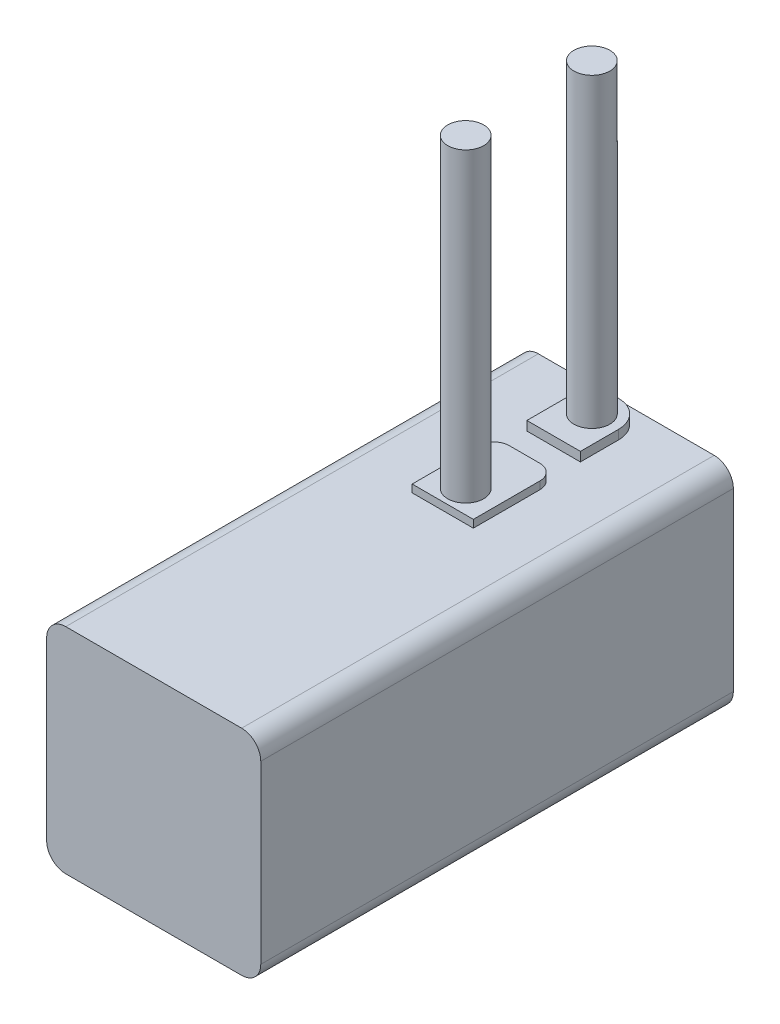
ISO-10303-21;
HEADER;
FILE_DESCRIPTION(('STEP AP214'),'2;1');
FILE_NAME('part.step','',(''),(''),'','','');
FILE_SCHEMA(('AUTOMOTIVE_DESIGN { 1 0 10303 214 1 1 1 1 }'));
ENDSEC;
DATA;
#1=APPLICATION_CONTEXT('core data for automotive mechanical design processes');
#2=APPLICATION_PROTOCOL_DEFINITION('international standard','automotive_design',2000,#1);
#3=PRODUCT_CONTEXT('',#1,'mechanical');
#4=PRODUCT('Part','Part','',(#3));
#5=PRODUCT_RELATED_PRODUCT_CATEGORY('part','',(#4));
#6=PRODUCT_DEFINITION_FORMATION('','',#4);
#7=PRODUCT_DEFINITION_CONTEXT('part definition',#1,'design');
#8=PRODUCT_DEFINITION('design','',#6,#7);
#9=PRODUCT_DEFINITION_SHAPE('','',#8);
#10=(LENGTH_UNIT() NAMED_UNIT(*) SI_UNIT(.MILLI.,.METRE.));
#11=(NAMED_UNIT(*) PLANE_ANGLE_UNIT() SI_UNIT($,.RADIAN.));
#12=(NAMED_UNIT(*) SI_UNIT($,.STERADIAN.) SOLID_ANGLE_UNIT());
#13=UNCERTAINTY_MEASURE_WITH_UNIT(LENGTH_MEASURE(1.E-05),#10,'distance_accuracy_value','');
#14=(GEOMETRIC_REPRESENTATION_CONTEXT(3) GLOBAL_UNCERTAINTY_ASSIGNED_CONTEXT((#13)) GLOBAL_UNIT_ASSIGNED_CONTEXT((#10,
#11,#12)) REPRESENTATION_CONTEXT('',''));
#15=CARTESIAN_POINT('',(0.,0.,0.));
#16=DIRECTION('',(0.,0.,1.));
#17=DIRECTION('',(1.,0.,0.));
#18=AXIS2_PLACEMENT_3D('',#15,#16,#17);
#19=CARTESIAN_POINT('',(-2.42693221990232,-2.5,-61.8));
#20=DIRECTION('',(0.,0.,-1.));
#21=DIRECTION('',(0.,1.,0.));
#22=AXIS2_PLACEMENT_3D('',#19,#20,#21);
#23=PLANE('',#22);
#24=DIRECTION('',(1.,0.,0.));
#25=VECTOR('',#24,1.);
#26=CARTESIAN_POINT('',(-2.42693221990232,-0.599999999999999,-61.8));
#27=LINE('',#26,#25);
#28=CARTESIAN_POINT('',(2.42693221990232,-0.599999999999999,-61.8));
#29=VERTEX_POINT('',#28);
#30=CARTESIAN_POINT('',(-2.42693221990232,-0.599999999999999,-61.8));
#31=VERTEX_POINT('',#30);
#32=EDGE_CURVE('E172',#29,#31,#27,.F.);
#33=ORIENTED_EDGE('',*,*,#32,.F.);
#34=CARTESIAN_POINT('',(0.,0.,-61.8));
#35=DIRECTION('',(0.,0.,-1.));
#36=DIRECTION('',(0.970772887960928,-0.24,0.));
#37=AXIS2_PLACEMENT_3D('',#34,#35,#36);
#38=CIRCLE('',#37,2.5);
#39=EDGE_CURVE('E162',#31,#29,#38,.F.);
#40=ORIENTED_EDGE('',*,*,#39,.F.);
#41=EDGE_LOOP('',(#33,#40));
#42=FACE_BOUND('',#41,.T.);
#43=ADVANCED_FACE('F17',(#42),#23,.T.);
#44=CARTESIAN_POINT('',(-2.42693221990232,0.6,-61.8));
#45=DIRECTION('',(0.,0.,-1.));
#46=DIRECTION('',(0.,1.,0.));
#47=AXIS2_PLACEMENT_3D('',#44,#45,#46);
#48=PLANE('',#47);
#49=DIRECTION('',(-1.,0.,0.));
#50=VECTOR('',#49,1.);
#51=CARTESIAN_POINT('',(2.42693221990232,0.6,-61.8));
#52=LINE('',#51,#50);
#53=CARTESIAN_POINT('',(-2.42693221990232,0.6,-61.8));
#54=VERTEX_POINT('',#53);
#55=CARTESIAN_POINT('',(2.42693221990232,0.6,-61.8));
#56=VERTEX_POINT('',#55);
#57=EDGE_CURVE('E171',#54,#56,#52,.F.);
#58=ORIENTED_EDGE('',*,*,#57,.F.);
#59=CARTESIAN_POINT('',(0.,0.,-61.8));
#60=DIRECTION('',(0.,0.,-1.));
#61=DIRECTION('',(-0.970772887960928,0.24,0.));
#62=AXIS2_PLACEMENT_3D('',#59,#60,#61);
#63=CIRCLE('',#62,2.5);
#64=EDGE_CURVE('E188',#56,#54,#63,.F.);
#65=ORIENTED_EDGE('',*,*,#64,.F.);
#66=EDGE_LOOP('',(#58,#65));
#67=FACE_BOUND('',#66,.T.);
#68=ADVANCED_FACE('F498',(#67),#48,.T.);
#69=CARTESIAN_POINT('',(-11.5,14.,-61.8));
#70=DIRECTION('',(0.,1.,0.));
#71=DIRECTION('',(0.,0.,1.));
#72=AXIS2_PLACEMENT_3D('',#69,#70,#71);
#73=PLANE('',#72);
#74=DIRECTION('',(1.,0.,0.));
#75=VECTOR('',#74,1.);
#76=CARTESIAN_POINT('',(-11.5,14.,0.));
#77=LINE('',#76,#75);
#78=CARTESIAN_POINT('',(11.5,14.,0.));
#79=VERTEX_POINT('',#78);
#80=CARTESIAN_POINT('',(-11.5,14.,0.));
#81=VERTEX_POINT('',#80);
#82=EDGE_CURVE('E192',#79,#81,#77,.F.);
#83=ORIENTED_EDGE('',*,*,#82,.F.);
#84=DIRECTION('',(0.,0.,-1.));
#85=VECTOR('',#84,1.);
#86=CARTESIAN_POINT('',(11.5,14.,0.));
#87=LINE('',#86,#85);
#88=CARTESIAN_POINT('',(11.5,14.,-61.8));
#89=VERTEX_POINT('',#88);
#90=EDGE_CURVE('E196',#89,#79,#87,.F.);
#91=ORIENTED_EDGE('',*,*,#90,.F.);
#92=DIRECTION('',(-1.,0.,0.));
#93=VECTOR('',#92,1.);
#94=CARTESIAN_POINT('',(11.5,14.,-61.8));
#95=LINE('',#94,#93);
#96=CARTESIAN_POINT('',(-11.5,14.,-61.8));
#97=VERTEX_POINT('',#96);
#98=EDGE_CURVE('E201',#89,#97,#95,.T.);
#99=ORIENTED_EDGE('',*,*,#98,.T.);
#100=DIRECTION('',(0.,0.,1.));
#101=VECTOR('',#100,1.);
#102=CARTESIAN_POINT('',(-11.5,14.,-61.8));
#103=LINE('',#102,#101);
#104=EDGE_CURVE('E206',#97,#81,#103,.T.);
#105=ORIENTED_EDGE('',*,*,#104,.T.);
#106=EDGE_LOOP('',(#83,#91,#99,#105));
#107=FACE_BOUND('',#106,.T.);
#108=DIRECTION('',(0.,0.,-1.));
#109=VECTOR('',#108,1.);
#110=CARTESIAN_POINT('',(-4.,14.,-37.8));
#111=LINE('',#110,#109);
#112=CARTESIAN_POINT('',(-4.,14.,-46.5));
#113=VERTEX_POINT('',#112);
#114=CARTESIAN_POINT('',(-4.,14.,-37.8));
#115=VERTEX_POINT('',#114);
#116=EDGE_CURVE('E211',#113,#115,#111,.F.);
#117=ORIENTED_EDGE('',*,*,#116,.F.);
#118=CARTESIAN_POINT('',(-1.99999999999984,14.,-46.5));
#119=DIRECTION('',(0.,-1.,0.));
#120=DIRECTION('',(-1.,0.,0.));
#121=AXIS2_PLACEMENT_3D('',#118,#119,#120);
#122=CIRCLE('',#121,2.00000000000015);
#123=CARTESIAN_POINT('',(-1.99999999999992,14.,-48.5000000000002));
#124=VERTEX_POINT('',#123);
#125=EDGE_CURVE('E216',#124,#113,#122,.F.);
#126=ORIENTED_EDGE('',*,*,#125,.F.);
#127=DIRECTION('',(1.,0.,0.));
#128=VECTOR('',#127,1.);
#129=CARTESIAN_POINT('',(-1.99999999999992,14.,-48.5000000000001));
#130=LINE('',#129,#128);
#131=CARTESIAN_POINT('',(1.99999999999993,14.,-48.5000000000001));
#132=VERTEX_POINT('',#131);
#133=EDGE_CURVE('E221',#132,#124,#130,.F.);
#134=ORIENTED_EDGE('',*,*,#133,.F.);
#135=CARTESIAN_POINT('',(1.99999999999984,14.,-46.5));
#136=DIRECTION('',(0.,-1.,0.));
#137=DIRECTION('',(0.,0.,-1.));
#138=AXIS2_PLACEMENT_3D('',#135,#136,#137);
#139=CIRCLE('',#138,2.00000000000016);
#140=CARTESIAN_POINT('',(4.,14.,-46.5));
#141=VERTEX_POINT('',#140);
#142=EDGE_CURVE('E225',#141,#132,#139,.F.);
#143=ORIENTED_EDGE('',*,*,#142,.F.);
#144=DIRECTION('',(0.,0.,1.));
#145=VECTOR('',#144,1.);
#146=CARTESIAN_POINT('',(4.,14.,-46.5));
#147=LINE('',#146,#145);
#148=CARTESIAN_POINT('',(4.,14.,-37.8));
#149=VERTEX_POINT('',#148);
#150=EDGE_CURVE('E230',#149,#141,#147,.F.);
#151=ORIENTED_EDGE('',*,*,#150,.F.);
#152=DIRECTION('',(-1.,0.,0.));
#153=VECTOR('',#152,1.);
#154=CARTESIAN_POINT('',(4.,14.,-37.8));
#155=LINE('',#154,#153);
#156=EDGE_CURVE('E235',#115,#149,#155,.F.);
#157=ORIENTED_EDGE('',*,*,#156,.F.);
#158=EDGE_LOOP('',(#117,#126,#134,#143,#151,#157));
#159=FACE_BOUND('',#158,.T.);
#160=DIRECTION('',(0.,0.,-1.));
#161=VECTOR('',#160,1.);
#162=CARTESIAN_POINT('',(-3.5,14.,-52.3));
#163=LINE('',#162,#161);
#164=CARTESIAN_POINT('',(-3.5,14.,-57.3));
#165=VERTEX_POINT('',#164);
#166=CARTESIAN_POINT('',(-3.5,14.,-52.3));
#167=VERTEX_POINT('',#166);
#168=EDGE_CURVE('E240',#165,#167,#163,.F.);
#169=ORIENTED_EDGE('',*,*,#168,.F.);
#170=CARTESIAN_POINT('',(0.,14.,-57.3));
#171=DIRECTION('',(0.,-1.,0.));
#172=DIRECTION('',(-1.,0.,0.));
#173=AXIS2_PLACEMENT_3D('',#170,#171,#172);
#174=CIRCLE('',#173,3.5);
#175=CARTESIAN_POINT('',(3.5,14.,-57.3));
#176=VERTEX_POINT('',#175);
#177=EDGE_CURVE('E245',#176,#165,#174,.F.);
#178=ORIENTED_EDGE('',*,*,#177,.F.);
#179=DIRECTION('',(0.,0.,1.));
#180=VECTOR('',#179,1.);
#181=CARTESIAN_POINT('',(3.5,14.,-57.3));
#182=LINE('',#181,#180);
#183=CARTESIAN_POINT('',(3.5,14.,-52.3));
#184=VERTEX_POINT('',#183);
#185=EDGE_CURVE('E250',#184,#176,#182,.F.);
#186=ORIENTED_EDGE('',*,*,#185,.F.);
#187=DIRECTION('',(-1.,0.,0.));
#188=VECTOR('',#187,1.);
#189=CARTESIAN_POINT('',(3.5,14.,-52.3));
#190=LINE('',#189,#188);
#191=EDGE_CURVE('E254',#167,#184,#190,.F.);
#192=ORIENTED_EDGE('',*,*,#191,.F.);
#193=EDGE_LOOP('',(#169,#178,#186,#192));
#194=FACE_BOUND('',#193,.T.);
#195=ADVANCED_FACE('F503',(#107,#159,#194),#73,.T.);
#196=CARTESIAN_POINT('',(-11.4999999999987,11.4999999999987,-61.8));
#197=DIRECTION('',(0.,0.,1.));
#198=DIRECTION('',(-5.03535931630014E-13,1.,0.));
#199=AXIS2_PLACEMENT_3D('',#196,#197,#198);
#200=CYLINDRICAL_SURFACE('',#199,2.50000000000126);
#201=CARTESIAN_POINT('',(-11.4999999999987,11.4999999999987,0.));
#202=DIRECTION('',(0.,0.,-1.));
#203=DIRECTION('',(-1.,5.03774799653657E-13,0.));
#204=AXIS2_PLACEMENT_3D('',#201,#202,#203);
#205=CIRCLE('',#204,2.50000000000126);
#206=CARTESIAN_POINT('',(-14.,11.5,0.));
#207=VERTEX_POINT('',#206);
#208=EDGE_CURVE('E259',#81,#207,#205,.F.);
#209=ORIENTED_EDGE('',*,*,#208,.F.);
#210=ORIENTED_EDGE('',*,*,#104,.F.);
#211=CARTESIAN_POINT('',(-11.4999999999987,11.4999999999987,-61.8));
#212=DIRECTION('',(0.,0.,1.));
#213=DIRECTION('',(-5.03774799653657E-13,1.,0.));
#214=AXIS2_PLACEMENT_3D('',#211,#212,#213);
#215=CIRCLE('',#214,2.50000000000126);
#216=CARTESIAN_POINT('',(-14.,11.5,-61.8));
#217=VERTEX_POINT('',#216);
#218=EDGE_CURVE('E263',#97,#217,#215,.T.);
#219=ORIENTED_EDGE('',*,*,#218,.T.);
#220=DIRECTION('',(0.,0.,1.));
#221=VECTOR('',#220,1.);
#222=CARTESIAN_POINT('',(-14.,11.5,-61.8));
#223=LINE('',#222,#221);
#224=EDGE_CURVE('E268',#217,#207,#223,.T.);
#225=ORIENTED_EDGE('',*,*,#224,.T.);
#226=EDGE_LOOP('',(#209,#210,#219,#225));
#227=FACE_BOUND('',#226,.T.);
#228=ADVANCED_FACE('F509',(#227),#200,.T.);
#229=CARTESIAN_POINT('',(-14.,-11.5,-61.8));
#230=DIRECTION('',(-1.,0.,0.));
#231=DIRECTION('',(0.,0.,1.));
#232=AXIS2_PLACEMENT_3D('',#229,#230,#231);
#233=PLANE('',#232);
#234=DIRECTION('',(0.,1.,0.));
#235=VECTOR('',#234,1.);
#236=CARTESIAN_POINT('',(-14.,-11.5,0.));
#237=LINE('',#236,#235);
#238=CARTESIAN_POINT('',(-14.,-11.5,0.));
#239=VERTEX_POINT('',#238);
#240=EDGE_CURVE('E273',#207,#239,#237,.F.);
#241=ORIENTED_EDGE('',*,*,#240,.F.);
#242=ORIENTED_EDGE('',*,*,#224,.F.);
#243=DIRECTION('',(0.,-1.,0.));
#244=VECTOR('',#243,1.);
#245=CARTESIAN_POINT('',(-14.,11.5,-61.8));
#246=LINE('',#245,#244);
#247=CARTESIAN_POINT('',(-14.,-11.5,-61.8));
#248=VERTEX_POINT('',#247);
#249=EDGE_CURVE('E277',#217,#248,#246,.T.);
#250=ORIENTED_EDGE('',*,*,#249,.T.);
#251=DIRECTION('',(0.,0.,1.));
#252=VECTOR('',#251,1.);
#253=CARTESIAN_POINT('',(-14.,-11.5,-61.8));
#254=LINE('',#253,#252);
#255=EDGE_CURVE('E282',#248,#239,#254,.T.);
#256=ORIENTED_EDGE('',*,*,#255,.T.);
#257=EDGE_LOOP('',(#241,#242,#250,#256));
#258=FACE_BOUND('',#257,.T.);
#259=ADVANCED_FACE('F513',(#258),#233,.T.);
#260=CARTESIAN_POINT('',(-11.4999999999987,-11.4999999999987,-61.8));
#261=DIRECTION('',(0.,0.,1.));
#262=DIRECTION('',(-1.,-5.03474699290056E-13,0.));
#263=AXIS2_PLACEMENT_3D('',#260,#261,#262);
#264=CYLINDRICAL_SURFACE('',#263,2.50000000000126);
#265=CARTESIAN_POINT('',(-11.4999999999987,-11.4999999999987,0.));
#266=DIRECTION('',(0.,0.,-1.));
#267=DIRECTION('',(-5.03774799653657E-13,-1.,0.));
#268=AXIS2_PLACEMENT_3D('',#265,#266,#267);
#269=CIRCLE('',#268,2.50000000000126);
#270=CARTESIAN_POINT('',(-11.5,-14.,0.));
#271=VERTEX_POINT('',#270);
#272=EDGE_CURVE('E287',#239,#271,#269,.F.);
#273=ORIENTED_EDGE('',*,*,#272,.F.);
#274=ORIENTED_EDGE('',*,*,#255,.F.);
#275=CARTESIAN_POINT('',(-11.4999999999987,-11.4999999999987,-61.8));
#276=DIRECTION('',(0.,0.,1.));
#277=DIRECTION('',(-1.,-5.03774799653657E-13,0.));
#278=AXIS2_PLACEMENT_3D('',#275,#276,#277);
#279=CIRCLE('',#278,2.50000000000126);
#280=CARTESIAN_POINT('',(-11.5,-14.,-61.8));
#281=VERTEX_POINT('',#280);
#282=EDGE_CURVE('E291',#248,#281,#279,.T.);
#283=ORIENTED_EDGE('',*,*,#282,.T.);
#284=DIRECTION('',(0.,0.,1.));
#285=VECTOR('',#284,1.);
#286=CARTESIAN_POINT('',(-11.5,-14.,-61.8));
#287=LINE('',#286,#285);
#288=EDGE_CURVE('E296',#281,#271,#287,.T.);
#289=ORIENTED_EDGE('',*,*,#288,.T.);
#290=EDGE_LOOP('',(#273,#274,#283,#289));
#291=FACE_BOUND('',#290,.T.);
#292=ADVANCED_FACE('F517',(#291),#264,.T.);
#293=CARTESIAN_POINT('',(-11.5,-14.,0.));
#294=DIRECTION('',(0.,-1.,0.));
#295=DIRECTION('',(0.,0.,-1.));
#296=AXIS2_PLACEMENT_3D('',#293,#294,#295);
#297=PLANE('',#296);
#298=DIRECTION('',(-1.,0.,0.));
#299=VECTOR('',#298,1.);
#300=CARTESIAN_POINT('',(11.5,-14.,0.));
#301=LINE('',#300,#299);
#302=CARTESIAN_POINT('',(11.5,-14.,0.));
#303=VERTEX_POINT('',#302);
#304=EDGE_CURVE('E301',#271,#303,#301,.F.);
#305=ORIENTED_EDGE('',*,*,#304,.F.);
#306=ORIENTED_EDGE('',*,*,#288,.F.);
#307=DIRECTION('',(1.,0.,0.));
#308=VECTOR('',#307,1.);
#309=CARTESIAN_POINT('',(-11.5,-14.,-61.8));
#310=LINE('',#309,#308);
#311=CARTESIAN_POINT('',(11.5,-14.,-61.8));
#312=VERTEX_POINT('',#311);
#313=EDGE_CURVE('E305',#281,#312,#310,.T.);
#314=ORIENTED_EDGE('',*,*,#313,.T.);
#315=DIRECTION('',(0.,0.,1.));
#316=VECTOR('',#315,1.);
#317=CARTESIAN_POINT('',(11.5,-14.,-61.8));
#318=LINE('',#317,#316);
#319=EDGE_CURVE('E310',#312,#303,#318,.T.);
#320=ORIENTED_EDGE('',*,*,#319,.T.);
#321=EDGE_LOOP('',(#305,#306,#314,#320));
#322=FACE_BOUND('',#321,.T.);
#323=ADVANCED_FACE('F521',(#322),#297,.T.);
#324=CARTESIAN_POINT('',(11.4999999999987,-11.4999999999987,-61.8));
#325=DIRECTION('',(0.,0.,1.));
#326=DIRECTION('',(5.02525288530399E-13,-1.,0.));
#327=AXIS2_PLACEMENT_3D('',#324,#325,#326);
#328=CYLINDRICAL_SURFACE('',#327,2.50000000000126);
#329=CARTESIAN_POINT('',(11.4999999999987,-11.4999999999987,0.));
#330=DIRECTION('',(0.,0.,-1.));
#331=DIRECTION('',(1.,-2.52242671194708E-13,0.));
#332=AXIS2_PLACEMENT_3D('',#329,#330,#331);
#333=CIRCLE('',#332,2.50000000000126);
#334=CARTESIAN_POINT('',(14.,-11.4999999999994,0.));
#335=VERTEX_POINT('',#334);
#336=EDGE_CURVE('E315',#303,#335,#333,.F.);
#337=ORIENTED_EDGE('',*,*,#336,.F.);
#338=ORIENTED_EDGE('',*,*,#319,.F.);
#339=CARTESIAN_POINT('',(11.4999999999987,-11.4999999999987,-61.8));
#340=DIRECTION('',(0.,0.,1.));
#341=DIRECTION('',(5.05195885125177E-13,-1.,0.));
#342=AXIS2_PLACEMENT_3D('',#339,#340,#341);
#343=CIRCLE('',#342,2.50000000000126);
#344=CARTESIAN_POINT('',(14.,-11.4999999999993,-61.8));
#345=VERTEX_POINT('',#344);
#346=EDGE_CURVE('E319',#312,#345,#343,.T.);
#347=ORIENTED_EDGE('',*,*,#346,.T.);
#348=DIRECTION('',(0.,0.,1.));
#349=VECTOR('',#348,1.);
#350=CARTESIAN_POINT('',(14.,-11.4999999999993,-61.8));
#351=LINE('',#350,#349);
#352=EDGE_CURVE('E324',#345,#335,#351,.T.);
#353=ORIENTED_EDGE('',*,*,#352,.T.);
#354=EDGE_LOOP('',(#337,#338,#347,#353));
#355=FACE_BOUND('',#354,.T.);
#356=ADVANCED_FACE('F525',(#355),#328,.T.);
#357=CARTESIAN_POINT('',(14.,-11.4999999999994,0.));
#358=DIRECTION('',(1.,0.,0.));
#359=DIRECTION('',(0.,0.,-1.));
#360=AXIS2_PLACEMENT_3D('',#357,#358,#359);
#361=PLANE('',#360);
#362=DIRECTION('',(0.,-1.,0.));
#363=VECTOR('',#362,1.);
#364=CARTESIAN_POINT('',(14.,11.4999999999999,0.));
#365=LINE('',#364,#363);
#366=CARTESIAN_POINT('',(14.,11.4999999999999,0.));
#367=VERTEX_POINT('',#366);
#368=EDGE_CURVE('E329',#335,#367,#365,.F.);
#369=ORIENTED_EDGE('',*,*,#368,.F.);
#370=ORIENTED_EDGE('',*,*,#352,.F.);
#371=DIRECTION('',(0.,1.,0.));
#372=VECTOR('',#371,1.);
#373=CARTESIAN_POINT('',(14.,-11.4999999999993,-61.8));
#374=LINE('',#373,#372);
#375=CARTESIAN_POINT('',(14.,11.4999999999999,-61.8));
#376=VERTEX_POINT('',#375);
#377=EDGE_CURVE('E333',#345,#376,#374,.T.);
#378=ORIENTED_EDGE('',*,*,#377,.T.);
#379=DIRECTION('',(0.,0.,1.));
#380=VECTOR('',#379,1.);
#381=CARTESIAN_POINT('',(14.,11.4999999999999,-61.8));
#382=LINE('',#381,#380);
#383=EDGE_CURVE('E338',#376,#367,#382,.T.);
#384=ORIENTED_EDGE('',*,*,#383,.T.);
#385=EDGE_LOOP('',(#369,#370,#378,#384));
#386=FACE_BOUND('',#385,.T.);
#387=ADVANCED_FACE('F529',(#386),#361,.T.);
#388=CARTESIAN_POINT('',(11.4999999999987,11.4999999999987,-61.8));
#389=DIRECTION('',(0.,0.,1.));
#390=DIRECTION('',(1.,0.,0.));
#391=AXIS2_PLACEMENT_3D('',#388,#389,#390);
#392=CYLINDRICAL_SURFACE('',#391,2.50000000000126);
#393=CARTESIAN_POINT('',(11.4999999999987,11.4999999999987,0.));
#394=DIRECTION('',(0.,0.,-1.));
#395=DIRECTION('',(5.06616970596696E-13,1.,0.));
#396=AXIS2_PLACEMENT_3D('',#393,#394,#395);
#397=CIRCLE('',#396,2.50000000000126);
#398=EDGE_CURVE('E343',#367,#79,#397,.F.);
#399=ORIENTED_EDGE('',*,*,#398,.F.);
#400=ORIENTED_EDGE('',*,*,#383,.F.);
#401=CARTESIAN_POINT('',(11.4999999999987,11.4999999999987,-61.8));
#402=DIRECTION('',(0.,0.,1.));
#403=DIRECTION('',(1.,4.63984406451112E-13,0.));
#404=AXIS2_PLACEMENT_3D('',#401,#402,#403);
#405=CIRCLE('',#404,2.50000000000126);
#406=EDGE_CURVE('E347',#376,#89,#405,.T.);
#407=ORIENTED_EDGE('',*,*,#406,.T.);
#408=ORIENTED_EDGE('',*,*,#90,.T.);
#409=EDGE_LOOP('',(#399,#400,#407,#408));
#410=FACE_BOUND('',#409,.T.);
#411=ADVANCED_FACE('F533',(#410),#392,.T.);
#412=CARTESIAN_POINT('',(-14.,-14.,-61.8));
#413=DIRECTION('',(0.,0.,-1.));
#414=DIRECTION('',(0.,1.,0.));
#415=AXIS2_PLACEMENT_3D('',#412,#413,#414);
#416=PLANE('',#415);
#417=ORIENTED_EDGE('',*,*,#218,.F.);
#418=ORIENTED_EDGE('',*,*,#98,.F.);
#419=ORIENTED_EDGE('',*,*,#406,.F.);
#420=ORIENTED_EDGE('',*,*,#377,.F.);
#421=ORIENTED_EDGE('',*,*,#346,.F.);
#422=ORIENTED_EDGE('',*,*,#313,.F.);
#423=ORIENTED_EDGE('',*,*,#282,.F.);
#424=ORIENTED_EDGE('',*,*,#249,.F.);
#425=EDGE_LOOP('',(#417,#418,#419,#420,#421,#422,#423,#424));
#426=FACE_BOUND('',#425,.T.);
#427=CARTESIAN_POINT('',(0.,0.,-61.8));
#428=DIRECTION('',(0.,0.,1.));
#429=DIRECTION('',(-1.,0.,0.));
#430=AXIS2_PLACEMENT_3D('',#427,#428,#429);
#431=CIRCLE('',#430,3.);
#432=CARTESIAN_POINT('',(-3.,0.,-61.8));
#433=VERTEX_POINT('',#432);
#434=EDGE_CURVE('E352',#433,#433,#431,.T.);
#435=ORIENTED_EDGE('',*,*,#434,.T.);
#436=EDGE_LOOP('',(#435));
#437=FACE_BOUND('',#436,.T.);
#438=ADVANCED_FACE('F537',(#426,#437),#416,.T.);
#439=CARTESIAN_POINT('',(-14.,-14.,0.));
#440=DIRECTION('',(0.,0.,1.));
#441=DIRECTION('',(1.,0.,0.));
#442=AXIS2_PLACEMENT_3D('',#439,#440,#441);
#443=PLANE('',#442);
#444=ORIENTED_EDGE('',*,*,#208,.T.);
#445=ORIENTED_EDGE('',*,*,#240,.T.);
#446=ORIENTED_EDGE('',*,*,#272,.T.);
#447=ORIENTED_EDGE('',*,*,#304,.T.);
#448=ORIENTED_EDGE('',*,*,#336,.T.);
#449=ORIENTED_EDGE('',*,*,#368,.T.);
#450=ORIENTED_EDGE('',*,*,#398,.T.);
#451=ORIENTED_EDGE('',*,*,#82,.T.);
#452=EDGE_LOOP('',(#444,#445,#446,#447,#448,#449,#450,#451));
#453=FACE_BOUND('',#452,.T.);
#454=ADVANCED_FACE('F541',(#453),#443,.T.);
#455=CARTESIAN_POINT('',(-1.99999999999984,15.,-46.5));
#456=DIRECTION('',(0.,-1.,0.));
#457=DIRECTION('',(-1.,0.,0.));
#458=AXIS2_PLACEMENT_3D('',#455,#456,#457);
#459=CYLINDRICAL_SURFACE('',#458,2.00000000000015);
#460=ORIENTED_EDGE('',*,*,#125,.T.);
#461=DIRECTION('',(0.,1.,0.));
#462=VECTOR('',#461,1.);
#463=CARTESIAN_POINT('',(-4.,14.,-46.5));
#464=LINE('',#463,#462);
#465=CARTESIAN_POINT('',(-4.,15.,-46.5));
#466=VERTEX_POINT('',#465);
#467=EDGE_CURVE('E357',#466,#113,#464,.F.);
#468=ORIENTED_EDGE('',*,*,#467,.F.);
#469=CARTESIAN_POINT('',(-1.99999999999984,15.,-46.5));
#470=DIRECTION('',(0.,-1.,0.));
#471=DIRECTION('',(-1.,0.,0.));
#472=AXIS2_PLACEMENT_3D('',#469,#470,#471);
#473=CIRCLE('',#472,2.00000000000015);
#474=CARTESIAN_POINT('',(-1.99999999999992,15.,-48.5000000000002));
#475=VERTEX_POINT('',#474);
#476=EDGE_CURVE('E359',#475,#466,#473,.F.);
#477=ORIENTED_EDGE('',*,*,#476,.F.);
#478=DIRECTION('',(0.,-1.,0.));
#479=VECTOR('',#478,1.);
#480=CARTESIAN_POINT('',(-1.99999999999992,15.,-48.5000000000002));
#481=LINE('',#480,#479);
#482=EDGE_CURVE('E363',#475,#124,#481,.T.);
#483=ORIENTED_EDGE('',*,*,#482,.T.);
#484=EDGE_LOOP('',(#460,#468,#477,#483));
#485=FACE_BOUND('',#484,.T.);
#486=ADVANCED_FACE('F545',(#485),#459,.T.);
#487=CARTESIAN_POINT('',(-4.,14.,-37.8));
#488=DIRECTION('',(-1.,0.,0.));
#489=DIRECTION('',(0.,1.,0.));
#490=AXIS2_PLACEMENT_3D('',#487,#488,#489);
#491=PLANE('',#490);
#492=ORIENTED_EDGE('',*,*,#116,.T.);
#493=DIRECTION('',(0.,1.,0.));
#494=VECTOR('',#493,1.);
#495=CARTESIAN_POINT('',(-4.,14.,-37.8));
#496=LINE('',#495,#494);
#497=CARTESIAN_POINT('',(-4.,15.,-37.8));
#498=VERTEX_POINT('',#497);
#499=EDGE_CURVE('E368',#498,#115,#496,.F.);
#500=ORIENTED_EDGE('',*,*,#499,.F.);
#501=DIRECTION('',(0.,0.,-1.));
#502=VECTOR('',#501,1.);
#503=CARTESIAN_POINT('',(-4.,15.,-37.8));
#504=LINE('',#503,#502);
#505=EDGE_CURVE('E372',#466,#498,#504,.F.);
#506=ORIENTED_EDGE('',*,*,#505,.F.);
#507=ORIENTED_EDGE('',*,*,#467,.T.);
#508=EDGE_LOOP('',(#492,#500,#506,#507));
#509=FACE_BOUND('',#508,.T.);
#510=ADVANCED_FACE('F549',(#509),#491,.T.);
#511=CARTESIAN_POINT('',(4.,14.,-37.8));
#512=DIRECTION('',(0.,0.,1.));
#513=DIRECTION('',(0.,1.,0.));
#514=AXIS2_PLACEMENT_3D('',#511,#512,#513);
#515=PLANE('',#514);
#516=ORIENTED_EDGE('',*,*,#156,.T.);
#517=DIRECTION('',(0.,1.,0.));
#518=VECTOR('',#517,1.);
#519=CARTESIAN_POINT('',(4.,14.,-37.8));
#520=LINE('',#519,#518);
#521=CARTESIAN_POINT('',(4.,15.,-37.8));
#522=VERTEX_POINT('',#521);
#523=EDGE_CURVE('E376',#522,#149,#520,.F.);
#524=ORIENTED_EDGE('',*,*,#523,.F.);
#525=DIRECTION('',(-1.,0.,0.));
#526=VECTOR('',#525,1.);
#527=CARTESIAN_POINT('',(4.,15.,-37.8));
#528=LINE('',#527,#526);
#529=EDGE_CURVE('E380',#498,#522,#528,.F.);
#530=ORIENTED_EDGE('',*,*,#529,.F.);
#531=ORIENTED_EDGE('',*,*,#499,.T.);
#532=EDGE_LOOP('',(#516,#524,#530,#531));
#533=FACE_BOUND('',#532,.T.);
#534=ADVANCED_FACE('F553',(#533),#515,.T.);
#535=CARTESIAN_POINT('',(4.,14.,-46.5));
#536=DIRECTION('',(1.,0.,0.));
#537=DIRECTION('',(0.,1.,0.));
#538=AXIS2_PLACEMENT_3D('',#535,#536,#537);
#539=PLANE('',#538);
#540=ORIENTED_EDGE('',*,*,#150,.T.);
#541=DIRECTION('',(0.,1.,0.));
#542=VECTOR('',#541,1.);
#543=CARTESIAN_POINT('',(4.,14.,-46.5));
#544=LINE('',#543,#542);
#545=CARTESIAN_POINT('',(4.,15.,-46.5));
#546=VERTEX_POINT('',#545);
#547=EDGE_CURVE('E384',#546,#141,#544,.F.);
#548=ORIENTED_EDGE('',*,*,#547,.F.);
#549=DIRECTION('',(0.,0.,1.));
#550=VECTOR('',#549,1.);
#551=CARTESIAN_POINT('',(4.,15.,-46.5));
#552=LINE('',#551,#550);
#553=EDGE_CURVE('E388',#522,#546,#552,.F.);
#554=ORIENTED_EDGE('',*,*,#553,.F.);
#555=ORIENTED_EDGE('',*,*,#523,.T.);
#556=EDGE_LOOP('',(#540,#548,#554,#555));
#557=FACE_BOUND('',#556,.T.);
#558=ADVANCED_FACE('F557',(#557),#539,.T.);
#559=CARTESIAN_POINT('',(1.99999999999984,15.,-46.5));
#560=DIRECTION('',(0.,-1.,0.));
#561=DIRECTION('',(0.,0.,-1.));
#562=AXIS2_PLACEMENT_3D('',#559,#560,#561);
#563=CYLINDRICAL_SURFACE('',#562,2.00000000000016);
#564=ORIENTED_EDGE('',*,*,#142,.T.);
#565=DIRECTION('',(0.,1.,0.));
#566=VECTOR('',#565,1.);
#567=CARTESIAN_POINT('',(1.99999999999992,14.,-48.5000000000002));
#568=LINE('',#567,#566);
#569=CARTESIAN_POINT('',(1.99999999999992,15.,-48.5000000000002));
#570=VERTEX_POINT('',#569);
#571=EDGE_CURVE('E392',#570,#132,#568,.F.);
#572=ORIENTED_EDGE('',*,*,#571,.F.);
#573=CARTESIAN_POINT('',(1.99999999999984,15.,-46.5));
#574=DIRECTION('',(0.,-1.,0.));
#575=DIRECTION('',(0.,0.,-1.));
#576=AXIS2_PLACEMENT_3D('',#573,#574,#575);
#577=CIRCLE('',#576,2.00000000000016);
#578=EDGE_CURVE('E396',#546,#570,#577,.F.);
#579=ORIENTED_EDGE('',*,*,#578,.F.);
#580=ORIENTED_EDGE('',*,*,#547,.T.);
#581=EDGE_LOOP('',(#564,#572,#579,#580));
#582=FACE_BOUND('',#581,.T.);
#583=ADVANCED_FACE('F561',(#582),#563,.T.);
#584=CARTESIAN_POINT('',(-1.99999999999992,14.,-48.5));
#585=DIRECTION('',(0.,0.,-1.));
#586=DIRECTION('',(0.,1.,0.));
#587=AXIS2_PLACEMENT_3D('',#584,#585,#586);
#588=PLANE('',#587);
#589=ORIENTED_EDGE('',*,*,#133,.T.);
#590=ORIENTED_EDGE('',*,*,#482,.F.);
#591=DIRECTION('',(1.,0.,0.));
#592=VECTOR('',#591,1.);
#593=CARTESIAN_POINT('',(-1.99999999999992,15.,-48.5));
#594=LINE('',#593,#592);
#595=EDGE_CURVE('E400',#570,#475,#594,.F.);
#596=ORIENTED_EDGE('',*,*,#595,.F.);
#597=ORIENTED_EDGE('',*,*,#571,.T.);
#598=EDGE_LOOP('',(#589,#590,#596,#597));
#599=FACE_BOUND('',#598,.T.);
#600=ADVANCED_FACE('F565',(#599),#588,.T.);
#601=CARTESIAN_POINT('',(-4.,15.,-48.5000000000002));
#602=DIRECTION('',(0.,1.,0.));
#603=DIRECTION('',(0.,0.,1.));
#604=AXIS2_PLACEMENT_3D('',#601,#602,#603);
#605=PLANE('',#604);
#606=ORIENTED_EDGE('',*,*,#476,.T.);
#607=ORIENTED_EDGE('',*,*,#505,.T.);
#608=ORIENTED_EDGE('',*,*,#529,.T.);
#609=ORIENTED_EDGE('',*,*,#553,.T.);
#610=ORIENTED_EDGE('',*,*,#578,.T.);
#611=ORIENTED_EDGE('',*,*,#595,.T.);
#612=EDGE_LOOP('',(#606,#607,#608,#609,#610,#611));
#613=FACE_BOUND('',#612,.T.);
#614=CARTESIAN_POINT('',(0.,15.,-40.8));
#615=DIRECTION('',(0.,-1.,0.));
#616=DIRECTION('',(0.,0.,1.));
#617=AXIS2_PLACEMENT_3D('',#614,#615,#616);
#618=CIRCLE('',#617,2.35);
#619=CARTESIAN_POINT('',(0.,15.,-38.45));
#620=VERTEX_POINT('',#619);
#621=EDGE_CURVE('E404',#620,#620,#618,.T.);
#622=ORIENTED_EDGE('',*,*,#621,.T.);
#623=EDGE_LOOP('',(#622));
#624=FACE_BOUND('',#623,.T.);
#625=ADVANCED_FACE('F569',(#613,#624),#605,.T.);
#626=CARTESIAN_POINT('',(0.,15.2,-57.3));
#627=DIRECTION('',(0.,-1.,0.));
#628=DIRECTION('',(-1.,0.,0.));
#629=AXIS2_PLACEMENT_3D('',#626,#627,#628);
#630=CYLINDRICAL_SURFACE('',#629,3.5);
#631=ORIENTED_EDGE('',*,*,#177,.T.);
#632=DIRECTION('',(0.,1.,0.));
#633=VECTOR('',#632,1.);
#634=CARTESIAN_POINT('',(-3.5,14.,-57.3));
#635=LINE('',#634,#633);
#636=CARTESIAN_POINT('',(-3.5,15.2,-57.3));
#637=VERTEX_POINT('',#636);
#638=EDGE_CURVE('E409',#637,#165,#635,.F.);
#639=ORIENTED_EDGE('',*,*,#638,.F.);
#640=CARTESIAN_POINT('',(0.,15.2,-57.3));
#641=DIRECTION('',(0.,-1.,0.));
#642=DIRECTION('',(-1.,0.,0.));
#643=AXIS2_PLACEMENT_3D('',#640,#641,#642);
#644=CIRCLE('',#643,3.5);
#645=CARTESIAN_POINT('',(3.5,15.2,-57.3));
#646=VERTEX_POINT('',#645);
#647=EDGE_CURVE('E411',#646,#637,#644,.F.);
#648=ORIENTED_EDGE('',*,*,#647,.F.);
#649=DIRECTION('',(0.,-1.,0.));
#650=VECTOR('',#649,1.);
#651=CARTESIAN_POINT('',(3.5,15.2,-57.3));
#652=LINE('',#651,#650);
#653=EDGE_CURVE('E415',#646,#176,#652,.T.);
#654=ORIENTED_EDGE('',*,*,#653,.T.);
#655=EDGE_LOOP('',(#631,#639,#648,#654));
#656=FACE_BOUND('',#655,.T.);
#657=ADVANCED_FACE('F573',(#656),#630,.T.);
#658=CARTESIAN_POINT('',(-3.5,14.,-52.3));
#659=DIRECTION('',(-1.,0.,0.));
#660=DIRECTION('',(0.,1.,0.));
#661=AXIS2_PLACEMENT_3D('',#658,#659,#660);
#662=PLANE('',#661);
#663=ORIENTED_EDGE('',*,*,#168,.T.);
#664=DIRECTION('',(0.,1.,0.));
#665=VECTOR('',#664,1.);
#666=CARTESIAN_POINT('',(-3.5,14.,-52.3));
#667=LINE('',#666,#665);
#668=CARTESIAN_POINT('',(-3.5,15.2,-52.3));
#669=VERTEX_POINT('',#668);
#670=EDGE_CURVE('E420',#669,#167,#667,.F.);
#671=ORIENTED_EDGE('',*,*,#670,.F.);
#672=DIRECTION('',(0.,0.,-1.));
#673=VECTOR('',#672,1.);
#674=CARTESIAN_POINT('',(-3.5,15.2,-52.3));
#675=LINE('',#674,#673);
#676=EDGE_CURVE('E424',#637,#669,#675,.F.);
#677=ORIENTED_EDGE('',*,*,#676,.F.);
#678=ORIENTED_EDGE('',*,*,#638,.T.);
#679=EDGE_LOOP('',(#663,#671,#677,#678));
#680=FACE_BOUND('',#679,.T.);
#681=ADVANCED_FACE('F577',(#680),#662,.T.);
#682=CARTESIAN_POINT('',(3.5,14.,-52.3));
#683=DIRECTION('',(0.,0.,1.));
#684=DIRECTION('',(0.,1.,0.));
#685=AXIS2_PLACEMENT_3D('',#682,#683,#684);
#686=PLANE('',#685);
#687=ORIENTED_EDGE('',*,*,#191,.T.);
#688=DIRECTION('',(0.,1.,0.));
#689=VECTOR('',#688,1.);
#690=CARTESIAN_POINT('',(3.5,14.,-52.3));
#691=LINE('',#690,#689);
#692=CARTESIAN_POINT('',(3.5,15.2,-52.3));
#693=VERTEX_POINT('',#692);
#694=EDGE_CURVE('E428',#693,#184,#691,.F.);
#695=ORIENTED_EDGE('',*,*,#694,.F.);
#696=DIRECTION('',(-1.,0.,0.));
#697=VECTOR('',#696,1.);
#698=CARTESIAN_POINT('',(3.5,15.2,-52.3));
#699=LINE('',#698,#697);
#700=EDGE_CURVE('E432',#669,#693,#699,.F.);
#701=ORIENTED_EDGE('',*,*,#700,.F.);
#702=ORIENTED_EDGE('',*,*,#670,.T.);
#703=EDGE_LOOP('',(#687,#695,#701,#702));
#704=FACE_BOUND('',#703,.T.);
#705=ADVANCED_FACE('F581',(#704),#686,.T.);
#706=CARTESIAN_POINT('',(3.5,14.,-57.3));
#707=DIRECTION('',(1.,0.,0.));
#708=DIRECTION('',(0.,1.,0.));
#709=AXIS2_PLACEMENT_3D('',#706,#707,#708);
#710=PLANE('',#709);
#711=ORIENTED_EDGE('',*,*,#185,.T.);
#712=ORIENTED_EDGE('',*,*,#653,.F.);
#713=DIRECTION('',(0.,0.,1.));
#714=VECTOR('',#713,1.);
#715=CARTESIAN_POINT('',(3.5,15.2,-57.3));
#716=LINE('',#715,#714);
#717=EDGE_CURVE('E436',#693,#646,#716,.F.);
#718=ORIENTED_EDGE('',*,*,#717,.F.);
#719=ORIENTED_EDGE('',*,*,#694,.T.);
#720=EDGE_LOOP('',(#711,#712,#718,#719));
#721=FACE_BOUND('',#720,.T.);
#722=ADVANCED_FACE('F585',(#721),#710,.T.);
#723=CARTESIAN_POINT('',(-3.5,15.2,-60.8));
#724=DIRECTION('',(0.,1.,0.));
#725=DIRECTION('',(0.,0.,1.));
#726=AXIS2_PLACEMENT_3D('',#723,#724,#725);
#727=PLANE('',#726);
#728=ORIENTED_EDGE('',*,*,#647,.T.);
#729=ORIENTED_EDGE('',*,*,#676,.T.);
#730=ORIENTED_EDGE('',*,*,#700,.T.);
#731=ORIENTED_EDGE('',*,*,#717,.T.);
#732=EDGE_LOOP('',(#728,#729,#730,#731));
#733=FACE_BOUND('',#732,.T.);
#734=CARTESIAN_POINT('',(0.,15.2,-57.3));
#735=DIRECTION('',(0.,-1.,0.));
#736=DIRECTION('',(-1.42053672654641E-07,0.,0.99999999999999));
#737=AXIS2_PLACEMENT_3D('',#734,#735,#736);
#738=CIRCLE('',#737,2.35);
#739=CARTESIAN_POINT('',(-3.33826130738406E-07,15.2,-54.95));
#740=VERTEX_POINT('',#739);
#741=EDGE_CURVE('E440',#740,#740,#738,.T.);
#742=ORIENTED_EDGE('',*,*,#741,.T.);
#743=EDGE_LOOP('',(#742));
#744=FACE_BOUND('',#743,.T.);
#745=ADVANCED_FACE('F589',(#733,#744),#727,.T.);
#746=CARTESIAN_POINT('',(-3.,-2.99999985498,-59.8));
#747=DIRECTION('',(0.,0.,-1.));
#748=DIRECTION('',(0.,1.,0.));
#749=AXIS2_PLACEMENT_3D('',#746,#747,#748);
#750=PLANE('',#749);
#751=CARTESIAN_POINT('',(0.,0.,-59.8));
#752=DIRECTION('',(0.,0.,-1.));
#753=DIRECTION('',(0.99999999999999,-1.41721879121093E-07,0.));
#754=AXIS2_PLACEMENT_3D('',#751,#752,#753);
#755=CIRCLE('',#754,3.);
#756=CARTESIAN_POINT('',(2.99999999999997,-4.2516563736328E-07,-59.8));
#757=VERTEX_POINT('',#756);
#758=EDGE_CURVE('E445',#757,#757,#755,.F.);
#759=ORIENTED_EDGE('',*,*,#758,.F.);
#760=EDGE_LOOP('',(#759));
#761=FACE_BOUND('',#760,.T.);
#762=CARTESIAN_POINT('',(0.,0.,-59.8));
#763=DIRECTION('',(0.,0.,1.));
#764=DIRECTION('',(-0.99999999999999,-1.41884393833892E-07,0.));
#765=AXIS2_PLACEMENT_3D('',#762,#763,#764);
#766=CIRCLE('',#765,2.5);
#767=CARTESIAN_POINT('',(-2.49999999999997,-3.54710984584729E-07,-59.8));
#768=VERTEX_POINT('',#767);
#769=EDGE_CURVE('E448',#768,#768,#766,.T.);
#770=ORIENTED_EDGE('',*,*,#769,.T.);
#771=EDGE_LOOP('',(#770));
#772=FACE_BOUND('',#771,.T.);
#773=ADVANCED_FACE('F593',(#761,#772),#750,.T.);
#774=CARTESIAN_POINT('',(-2.5,-0.600000000000001,-60.8));
#775=DIRECTION('',(0.,0.,-1.));
#776=DIRECTION('',(0.,1.,0.));
#777=AXIS2_PLACEMENT_3D('',#774,#775,#776);
#778=PLANE('',#777);
#779=DIRECTION('',(1.,0.,0.));
#780=VECTOR('',#779,1.);
#781=CARTESIAN_POINT('',(-2.42693221990232,0.6,-60.8));
#782=LINE('',#781,#780);
#783=CARTESIAN_POINT('',(2.42693221990232,0.6,-60.8));
#784=VERTEX_POINT('',#783);
#785=CARTESIAN_POINT('',(-2.42693221990232,0.6,-60.8));
#786=VERTEX_POINT('',#785);
#787=EDGE_CURVE('E451',#784,#786,#782,.F.);
#788=ORIENTED_EDGE('',*,*,#787,.F.);
#789=CARTESIAN_POINT('',(0.,0.,-60.8));
#790=DIRECTION('',(0.,0.,-1.));
#791=DIRECTION('',(1.,0.,0.));
#792=AXIS2_PLACEMENT_3D('',#789,#790,#791);
#793=CIRCLE('',#792,2.5);
#794=CARTESIAN_POINT('',(2.42693221990232,-0.600000000000001,-60.8));
#795=VERTEX_POINT('',#794);
#796=EDGE_CURVE('E454',#795,#784,#793,.F.);
#797=ORIENTED_EDGE('',*,*,#796,.F.);
#798=DIRECTION('',(-1.,0.,0.));
#799=VECTOR('',#798,1.);
#800=CARTESIAN_POINT('',(2.42693221990232,-0.6,-60.8));
#801=LINE('',#800,#799);
#802=CARTESIAN_POINT('',(-2.42693221990232,-0.6,-60.8));
#803=VERTEX_POINT('',#802);
#804=EDGE_CURVE('E178',#803,#795,#801,.F.);
#805=ORIENTED_EDGE('',*,*,#804,.F.);
#806=CARTESIAN_POINT('',(0.,0.,-60.8));
#807=DIRECTION('',(0.,0.,-1.));
#808=DIRECTION('',(-1.,0.,0.));
#809=AXIS2_PLACEMENT_3D('',#806,#807,#808);
#810=CIRCLE('',#809,2.5);
#811=EDGE_CURVE('E36',#786,#803,#810,.F.);
#812=ORIENTED_EDGE('',*,*,#811,.F.);
#813=EDGE_LOOP('',(#788,#797,#805,#812));
#814=FACE_BOUND('',#813,.T.);
#815=ADVANCED_FACE('F597',(#814),#778,.T.);
#816=CARTESIAN_POINT('',(-2.42693221990232,-0.6,-61.8));
#817=DIRECTION('',(0.,1.,0.));
#818=DIRECTION('',(0.,0.,1.));
#819=AXIS2_PLACEMENT_3D('',#816,#817,#818);
#820=PLANE('',#819);
#821=DIRECTION('',(0.,0.,-1.));
#822=VECTOR('',#821,1.);
#823=CARTESIAN_POINT('',(2.42693221990232,-0.6,-60.8));
#824=LINE('',#823,#822);
#825=EDGE_CURVE('E165',#795,#29,#824,.T.);
#826=ORIENTED_EDGE('',*,*,#825,.T.);
#827=ORIENTED_EDGE('',*,*,#32,.T.);
#828=DIRECTION('',(0.,0.,1.));
#829=VECTOR('',#828,1.);
#830=CARTESIAN_POINT('',(-2.42693221990232,-0.6,-61.8));
#831=LINE('',#830,#829);
#832=EDGE_CURVE('E167',#31,#803,#831,.T.);
#833=ORIENTED_EDGE('',*,*,#832,.T.);
#834=ORIENTED_EDGE('',*,*,#804,.T.);
#835=EDGE_LOOP('',(#826,#827,#833,#834));
#836=FACE_BOUND('',#835,.T.);
#837=ADVANCED_FACE('F176',(#836),#820,.T.);
#838=CARTESIAN_POINT('',(-2.42693221990232,0.6,-60.8));
#839=DIRECTION('',(0.,-1.,0.));
#840=DIRECTION('',(0.,0.,-1.));
#841=AXIS2_PLACEMENT_3D('',#838,#839,#840);
#842=PLANE('',#841);
#843=DIRECTION('',(0.,0.,-1.));
#844=VECTOR('',#843,1.);
#845=CARTESIAN_POINT('',(-2.42693221990232,0.6,-60.8));
#846=LINE('',#845,#844);
#847=EDGE_CURVE('E32',#786,#54,#846,.T.);
#848=ORIENTED_EDGE('',*,*,#847,.T.);
#849=ORIENTED_EDGE('',*,*,#57,.T.);
#850=DIRECTION('',(0.,0.,1.));
#851=VECTOR('',#850,1.);
#852=CARTESIAN_POINT('',(2.42693221990232,0.6,-61.8));
#853=LINE('',#852,#851);
#854=EDGE_CURVE('E472',#56,#784,#853,.T.);
#855=ORIENTED_EDGE('',*,*,#854,.T.);
#856=ORIENTED_EDGE('',*,*,#787,.T.);
#857=EDGE_LOOP('',(#848,#849,#855,#856));
#858=FACE_BOUND('',#857,.T.);
#859=ADVANCED_FACE('F486',(#858),#842,.T.);
#860=CARTESIAN_POINT('',(-2.35000000000002,55.,-38.4499998196468));
#861=DIRECTION('',(0.,1.,0.));
#862=DIRECTION('',(1.,0.,0.));
#863=AXIS2_PLACEMENT_3D('',#860,#861,#862);
#864=PLANE('',#863);
#865=CARTESIAN_POINT('',(0.,55.,-40.8));
#866=DIRECTION('',(0.,1.,0.));
#867=DIRECTION('',(0.,0.,-1.));
#868=AXIS2_PLACEMENT_3D('',#865,#866,#867);
#869=CIRCLE('',#868,2.35);
#870=CARTESIAN_POINT('',(0.,55.,-43.15));
#871=VERTEX_POINT('',#870);
#872=EDGE_CURVE('E25',#871,#871,#869,.F.);
#873=ORIENTED_EDGE('',*,*,#872,.F.);
#874=EDGE_LOOP('',(#873));
#875=FACE_BOUND('',#874,.T.);
#876=ADVANCED_FACE('F483',(#875),#864,.T.);
#877=CARTESIAN_POINT('',(-2.35000000000002,55.2,-54.9499998198802));
#878=DIRECTION('',(0.,1.,0.));
#879=DIRECTION('',(1.,0.,0.));
#880=AXIS2_PLACEMENT_3D('',#877,#878,#879);
#881=PLANE('',#880);
#882=CARTESIAN_POINT('',(0.,55.2,-57.3));
#883=DIRECTION('',(0.,1.,0.));
#884=DIRECTION('',(0.,0.,-1.));
#885=AXIS2_PLACEMENT_3D('',#882,#883,#884);
#886=CIRCLE('',#885,2.35);
#887=CARTESIAN_POINT('',(0.,55.2,-59.65));
#888=VERTEX_POINT('',#887);
#889=EDGE_CURVE('E11',#888,#888,#886,.F.);
#890=ORIENTED_EDGE('',*,*,#889,.F.);
#891=EDGE_LOOP('',(#890));
#892=FACE_BOUND('',#891,.T.);
#893=ADVANCED_FACE('F485',(#892),#881,.T.);
#894=CARTESIAN_POINT('',(0.,0.,-59.8));
#895=DIRECTION('',(0.,0.,-1.));
#896=DIRECTION('',(1.,0.,0.));
#897=AXIS2_PLACEMENT_3D('',#894,#895,#896);
#898=CYLINDRICAL_SURFACE('',#897,2.5);
#899=ORIENTED_EDGE('',*,*,#769,.F.);
#900=EDGE_LOOP('',(#899));
#901=FACE_BOUND('',#900,.T.);
#902=ORIENTED_EDGE('',*,*,#832,.F.);
#903=ORIENTED_EDGE('',*,*,#39,.T.);
#904=ORIENTED_EDGE('',*,*,#825,.F.);
#905=ORIENTED_EDGE('',*,*,#796,.T.);
#906=ORIENTED_EDGE('',*,*,#854,.F.);
#907=ORIENTED_EDGE('',*,*,#64,.T.);
#908=ORIENTED_EDGE('',*,*,#847,.F.);
#909=ORIENTED_EDGE('',*,*,#811,.T.);
#910=EDGE_LOOP('',(#902,#903,#904,#905,#906,#907,#908,#909));
#911=FACE_BOUND('',#910,.T.);
#912=ADVANCED_FACE('F164',(#901,#911),#898,.T.);
#913=CARTESIAN_POINT('',(0.,0.,-59.8));
#914=DIRECTION('',(0.,0.,-1.));
#915=DIRECTION('',(1.,0.,0.));
#916=AXIS2_PLACEMENT_3D('',#913,#914,#915);
#917=CYLINDRICAL_SURFACE('',#916,3.);
#918=ORIENTED_EDGE('',*,*,#758,.T.);
#919=EDGE_LOOP('',(#918));
#920=FACE_BOUND('',#919,.T.);
#921=ORIENTED_EDGE('',*,*,#434,.F.);
#922=EDGE_LOOP('',(#921));
#923=FACE_BOUND('',#922,.T.);
#924=ADVANCED_FACE('F635',(#920,#923),#917,.F.);
#925=CARTESIAN_POINT('',(0.,15.,-40.8));
#926=DIRECTION('',(0.,-1.,0.));
#927=DIRECTION('',(1.42006570625137E-07,0.,0.99999999999999));
#928=AXIS2_PLACEMENT_3D('',#925,#926,#927);
#929=CYLINDRICAL_SURFACE('',#928,2.35);
#930=ORIENTED_EDGE('',*,*,#621,.F.);
#931=EDGE_LOOP('',(#930));
#932=FACE_BOUND('',#931,.T.);
#933=ORIENTED_EDGE('',*,*,#872,.T.);
#934=EDGE_LOOP('',(#933));
#935=FACE_BOUND('',#934,.T.);
#936=ADVANCED_FACE('F481',(#932,#935),#929,.T.);
#937=CARTESIAN_POINT('',(0.,15.2,-57.3));
#938=DIRECTION('',(0.,-1.,0.));
#939=DIRECTION('',(1.4182277320341E-07,0.,0.99999999999999));
#940=AXIS2_PLACEMENT_3D('',#937,#938,#939);
#941=CYLINDRICAL_SURFACE('',#940,2.35);
#942=ORIENTED_EDGE('',*,*,#741,.F.);
#943=EDGE_LOOP('',(#942));
#944=FACE_BOUND('',#943,.T.);
#945=ORIENTED_EDGE('',*,*,#889,.T.);
#946=EDGE_LOOP('',(#945));
#947=FACE_BOUND('',#946,.T.);
#948=ADVANCED_FACE('F19',(#944,#947),#941,.T.);
#949=CLOSED_SHELL('',(#43,#68,#195,#228,#259,#292,#323,#356,#387,#411,#438,#454,#486,#510,#534,
#558,#583,#600,#625,#657,#681,#705,#722,#745,#773,#815,#837,#859,#876,#893,#912,#924,#936,#948));
#950=MANIFOLD_SOLID_BREP('B1',#949);
#951=ADVANCED_BREP_SHAPE_REPRESENTATION('',(#18,#950),#14);
#952=SHAPE_DEFINITION_REPRESENTATION(#9,#951);
ENDSEC;
END-ISO-10303-21;
